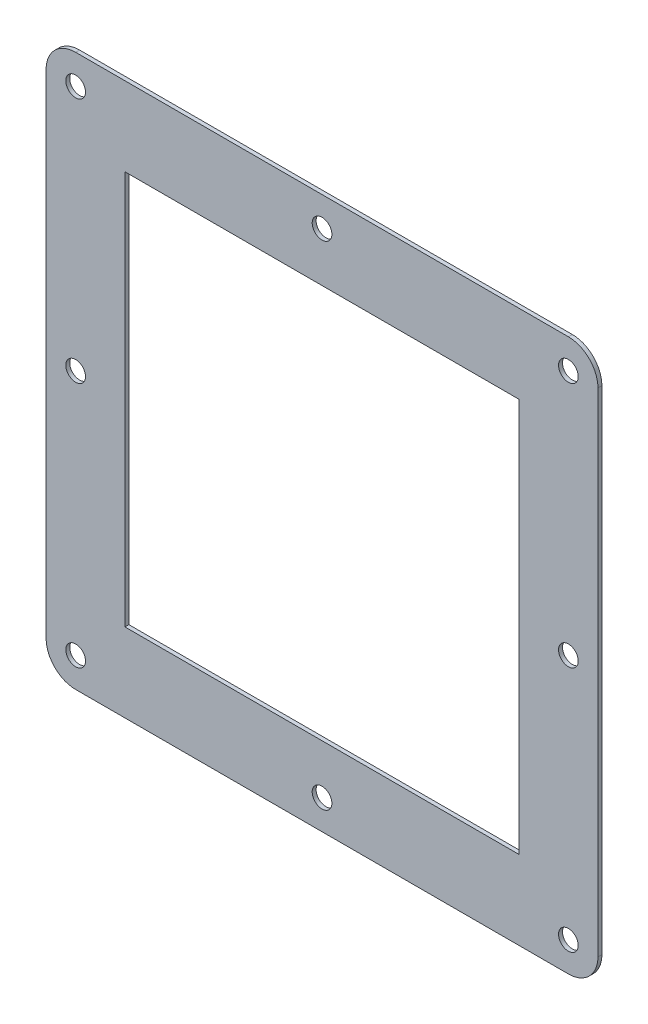
ISO-10303-21;
HEADER;
FILE_DESCRIPTION(('STEP AP214'),'2;1');
FILE_NAME('part.step','',(''),(''),'','','');
FILE_SCHEMA(('AUTOMOTIVE_DESIGN { 1 0 10303 214 1 1 1 1 }'));
ENDSEC;
DATA;
#1=APPLICATION_CONTEXT('core data for automotive mechanical design processes');
#2=APPLICATION_PROTOCOL_DEFINITION('international standard','automotive_design',2000,#1);
#3=PRODUCT_CONTEXT('',#1,'mechanical');
#4=PRODUCT('Part','Part','',(#3));
#5=PRODUCT_RELATED_PRODUCT_CATEGORY('part','',(#4));
#6=PRODUCT_DEFINITION_FORMATION('','',#4);
#7=PRODUCT_DEFINITION_CONTEXT('part definition',#1,'design');
#8=PRODUCT_DEFINITION('design','',#6,#7);
#9=PRODUCT_DEFINITION_SHAPE('','',#8);
#10=(LENGTH_UNIT() NAMED_UNIT(*) SI_UNIT(.MILLI.,.METRE.));
#11=(NAMED_UNIT(*) PLANE_ANGLE_UNIT() SI_UNIT($,.RADIAN.));
#12=(NAMED_UNIT(*) SI_UNIT($,.STERADIAN.) SOLID_ANGLE_UNIT());
#13=UNCERTAINTY_MEASURE_WITH_UNIT(LENGTH_MEASURE(1.E-05),#10,'distance_accuracy_value','');
#14=(GEOMETRIC_REPRESENTATION_CONTEXT(3) GLOBAL_UNCERTAINTY_ASSIGNED_CONTEXT((#13)) GLOBAL_UNIT_ASSIGNED_CONTEXT((#10,
#11,#12)) REPRESENTATION_CONTEXT('',''));
#15=CARTESIAN_POINT('',(0.,0.,0.));
#16=DIRECTION('',(0.,0.,1.));
#17=DIRECTION('',(1.,0.,0.));
#18=AXIS2_PLACEMENT_3D('',#15,#16,#17);
#19=CARTESIAN_POINT('',(-125.,-125.,2.));
#20=DIRECTION('',(0.,0.,1.));
#21=DIRECTION('',(1.,0.,0.));
#22=AXIS2_PLACEMENT_3D('',#19,#20,#21);
#23=PLANE('',#22);
#24=DIRECTION('',(0.,1.,0.));
#25=VECTOR('',#24,1.);
#26=CARTESIAN_POINT('',(100.,100.,2.));
#27=LINE('',#26,#25);
#28=CARTESIAN_POINT('',(100.,-100.,2.));
#29=VERTEX_POINT('',#28);
#30=CARTESIAN_POINT('',(100.,100.,2.));
#31=VERTEX_POINT('',#30);
#32=EDGE_CURVE('E48',#29,#31,#27,.T.);
#33=ORIENTED_EDGE('',*,*,#32,.F.);
#34=DIRECTION('',(1.,0.,0.));
#35=VECTOR('',#34,1.);
#36=CARTESIAN_POINT('',(-100.,-100.,2.));
#37=LINE('',#36,#35);
#38=CARTESIAN_POINT('',(-100.,-100.,2.));
#39=VERTEX_POINT('',#38);
#40=EDGE_CURVE('E140',#39,#29,#37,.T.);
#41=ORIENTED_EDGE('',*,*,#40,.F.);
#42=DIRECTION('',(0.,-1.,0.));
#43=VECTOR('',#42,1.);
#44=CARTESIAN_POINT('',(-100.,100.,2.));
#45=LINE('',#44,#43);
#46=CARTESIAN_POINT('',(-100.,100.,2.));
#47=VERTEX_POINT('',#46);
#48=EDGE_CURVE('E125',#47,#39,#45,.T.);
#49=ORIENTED_EDGE('',*,*,#48,.F.);
#50=DIRECTION('',(-1.,0.,0.));
#51=VECTOR('',#50,1.);
#52=CARTESIAN_POINT('',(-100.,100.,2.));
#53=LINE('',#52,#51);
#54=EDGE_CURVE('E134',#31,#47,#53,.T.);
#55=ORIENTED_EDGE('',*,*,#54,.F.);
#56=EDGE_LOOP('',(#33,#41,#49,#55));
#57=FACE_BOUND('',#56,.T.);
#58=CARTESIAN_POINT('',(0.,-125.,2.));
#59=DIRECTION('',(0.,0.,1.));
#60=DIRECTION('',(1.,0.,0.));
#61=AXIS2_PLACEMENT_3D('',#58,#59,#60);
#62=CIRCLE('',#61,5.);
#63=CARTESIAN_POINT('',(5.,-125.,2.));
#64=VERTEX_POINT('',#63);
#65=EDGE_CURVE('E156',#64,#64,#62,.T.);
#66=ORIENTED_EDGE('',*,*,#65,.F.);
#67=EDGE_LOOP('',(#66));
#68=FACE_BOUND('',#67,.T.);
#69=CARTESIAN_POINT('',(125.,0.,2.));
#70=DIRECTION('',(0.,0.,1.));
#71=DIRECTION('',(1.,0.,0.));
#72=AXIS2_PLACEMENT_3D('',#69,#70,#71);
#73=CIRCLE('',#72,5.00000000000001);
#74=CARTESIAN_POINT('',(130.,0.,2.));
#75=VERTEX_POINT('',#74);
#76=EDGE_CURVE('E174',#75,#75,#73,.T.);
#77=ORIENTED_EDGE('',*,*,#76,.F.);
#78=EDGE_LOOP('',(#77));
#79=FACE_BOUND('',#78,.T.);
#80=CARTESIAN_POINT('',(0.,125.,2.));
#81=DIRECTION('',(0.,0.,1.));
#82=DIRECTION('',(1.,0.,0.));
#83=AXIS2_PLACEMENT_3D('',#80,#81,#82);
#84=CIRCLE('',#83,5.);
#85=CARTESIAN_POINT('',(4.99999999999999,125.,2.));
#86=VERTEX_POINT('',#85);
#87=EDGE_CURVE('E186',#86,#86,#84,.T.);
#88=ORIENTED_EDGE('',*,*,#87,.F.);
#89=EDGE_LOOP('',(#88));
#90=FACE_BOUND('',#89,.T.);
#91=CARTESIAN_POINT('',(-125.,-125.,2.));
#92=DIRECTION('',(0.,0.,1.));
#93=DIRECTION('',(1.,0.,0.));
#94=AXIS2_PLACEMENT_3D('',#91,#92,#93);
#95=CIRCLE('',#94,15.);
#96=CARTESIAN_POINT('',(-140.,-125.,2.));
#97=VERTEX_POINT('',#96);
#98=CARTESIAN_POINT('',(-125.,-140.,2.));
#99=VERTEX_POINT('',#98);
#100=EDGE_CURVE('E198',#97,#99,#95,.T.);
#101=ORIENTED_EDGE('',*,*,#100,.T.);
#102=DIRECTION('',(1.,0.,0.));
#103=VECTOR('',#102,1.);
#104=CARTESIAN_POINT('',(-125.,-140.,2.));
#105=LINE('',#104,#103);
#106=CARTESIAN_POINT('',(125.,-140.,2.));
#107=VERTEX_POINT('',#106);
#108=EDGE_CURVE('E201',#99,#107,#105,.T.);
#109=ORIENTED_EDGE('',*,*,#108,.T.);
#110=CARTESIAN_POINT('',(125.,-125.,2.));
#111=DIRECTION('',(0.,0.,1.));
#112=DIRECTION('',(1.,0.,0.));
#113=AXIS2_PLACEMENT_3D('',#110,#111,#112);
#114=CIRCLE('',#113,15.);
#115=CARTESIAN_POINT('',(140.,-125.,2.));
#116=VERTEX_POINT('',#115);
#117=EDGE_CURVE('E204',#107,#116,#114,.T.);
#118=ORIENTED_EDGE('',*,*,#117,.T.);
#119=DIRECTION('',(0.,1.,0.));
#120=VECTOR('',#119,1.);
#121=CARTESIAN_POINT('',(140.,125.,2.));
#122=LINE('',#121,#120);
#123=CARTESIAN_POINT('',(140.,125.,2.));
#124=VERTEX_POINT('',#123);
#125=EDGE_CURVE('E206',#116,#124,#122,.T.);
#126=ORIENTED_EDGE('',*,*,#125,.T.);
#127=CARTESIAN_POINT('',(125.,125.,2.));
#128=DIRECTION('',(0.,0.,1.));
#129=DIRECTION('',(-1.,0.,0.));
#130=AXIS2_PLACEMENT_3D('',#127,#128,#129);
#131=CIRCLE('',#130,15.);
#132=CARTESIAN_POINT('',(125.,140.,2.));
#133=VERTEX_POINT('',#132);
#134=EDGE_CURVE('E208',#124,#133,#131,.T.);
#135=ORIENTED_EDGE('',*,*,#134,.T.);
#136=DIRECTION('',(-1.,0.,0.));
#137=VECTOR('',#136,1.);
#138=CARTESIAN_POINT('',(-125.,140.,2.));
#139=LINE('',#138,#137);
#140=CARTESIAN_POINT('',(-125.,140.,2.));
#141=VERTEX_POINT('',#140);
#142=EDGE_CURVE('E210',#133,#141,#139,.T.);
#143=ORIENTED_EDGE('',*,*,#142,.T.);
#144=CARTESIAN_POINT('',(-125.,125.,2.));
#145=DIRECTION('',(0.,0.,1.));
#146=DIRECTION('',(1.,0.,0.));
#147=AXIS2_PLACEMENT_3D('',#144,#145,#146);
#148=CIRCLE('',#147,15.);
#149=CARTESIAN_POINT('',(-140.,125.,2.));
#150=VERTEX_POINT('',#149);
#151=EDGE_CURVE('E212',#141,#150,#148,.T.);
#152=ORIENTED_EDGE('',*,*,#151,.T.);
#153=DIRECTION('',(0.,-1.,0.));
#154=VECTOR('',#153,1.);
#155=CARTESIAN_POINT('',(-140.,125.,2.));
#156=LINE('',#155,#154);
#157=EDGE_CURVE('E214',#150,#97,#156,.T.);
#158=ORIENTED_EDGE('',*,*,#157,.T.);
#159=EDGE_LOOP('',(#101,#109,#118,#126,#135,#143,#152,#158));
#160=FACE_BOUND('',#159,.T.);
#161=CARTESIAN_POINT('',(-125.,125.,2.));
#162=DIRECTION('',(0.,0.,1.));
#163=DIRECTION('',(1.,0.,0.));
#164=AXIS2_PLACEMENT_3D('',#161,#162,#163);
#165=CIRCLE('',#164,5.00000000000001);
#166=CARTESIAN_POINT('',(-120.,125.,2.));
#167=VERTEX_POINT('',#166);
#168=EDGE_CURVE('E192',#167,#167,#165,.T.);
#169=ORIENTED_EDGE('',*,*,#168,.F.);
#170=EDGE_LOOP('',(#169));
#171=FACE_BOUND('',#170,.T.);
#172=CARTESIAN_POINT('',(125.,125.,2.));
#173=DIRECTION('',(0.,0.,1.));
#174=DIRECTION('',(1.,0.,0.));
#175=AXIS2_PLACEMENT_3D('',#172,#173,#174);
#176=CIRCLE('',#175,4.99999999999999);
#177=CARTESIAN_POINT('',(130.,125.,2.));
#178=VERTEX_POINT('',#177);
#179=EDGE_CURVE('E180',#178,#178,#176,.T.);
#180=ORIENTED_EDGE('',*,*,#179,.F.);
#181=EDGE_LOOP('',(#180));
#182=FACE_BOUND('',#181,.T.);
#183=CARTESIAN_POINT('',(-125.,0.,2.));
#184=DIRECTION('',(0.,0.,1.));
#185=DIRECTION('',(1.,0.,0.));
#186=AXIS2_PLACEMENT_3D('',#183,#184,#185);
#187=CIRCLE('',#186,5.);
#188=CARTESIAN_POINT('',(-120.,0.,2.));
#189=VERTEX_POINT('',#188);
#190=EDGE_CURVE('E168',#189,#189,#187,.T.);
#191=ORIENTED_EDGE('',*,*,#190,.F.);
#192=EDGE_LOOP('',(#191));
#193=FACE_BOUND('',#192,.T.);
#194=CARTESIAN_POINT('',(-125.,-125.,2.));
#195=DIRECTION('',(0.,0.,1.));
#196=DIRECTION('',(1.,0.,0.));
#197=AXIS2_PLACEMENT_3D('',#194,#195,#196);
#198=CIRCLE('',#197,5.00000000000001);
#199=CARTESIAN_POINT('',(-120.,-125.,2.));
#200=VERTEX_POINT('',#199);
#201=EDGE_CURVE('E162',#200,#200,#198,.T.);
#202=ORIENTED_EDGE('',*,*,#201,.F.);
#203=EDGE_LOOP('',(#202));
#204=FACE_BOUND('',#203,.T.);
#205=CARTESIAN_POINT('',(125.,-125.,2.));
#206=DIRECTION('',(0.,0.,1.));
#207=DIRECTION('',(1.,0.,0.));
#208=AXIS2_PLACEMENT_3D('',#205,#206,#207);
#209=CIRCLE('',#208,5.00000000000002);
#210=CARTESIAN_POINT('',(130.,-125.,2.));
#211=VERTEX_POINT('',#210);
#212=EDGE_CURVE('E150',#211,#211,#209,.T.);
#213=ORIENTED_EDGE('',*,*,#212,.F.);
#214=EDGE_LOOP('',(#213));
#215=FACE_BOUND('',#214,.T.);
#216=ADVANCED_FACE('F33',(#57,#68,#79,#90,#160,#171,#182,#193,#204,#215),#23,.T.);
#217=CARTESIAN_POINT('',(-125.,-125.,0.));
#218=DIRECTION('',(0.,0.,1.));
#219=DIRECTION('',(1.,0.,0.));
#220=AXIS2_PLACEMENT_3D('',#217,#218,#219);
#221=PLANE('',#220);
#222=DIRECTION('',(1.,0.,0.));
#223=VECTOR('',#222,1.);
#224=CARTESIAN_POINT('',(-125.,-100.,0.));
#225=LINE('',#224,#223);
#226=CARTESIAN_POINT('',(-100.,-100.,0.));
#227=VERTEX_POINT('',#226);
#228=CARTESIAN_POINT('',(100.,-100.,0.));
#229=VERTEX_POINT('',#228);
#230=EDGE_CURVE('E41',#227,#229,#225,.T.);
#231=ORIENTED_EDGE('',*,*,#230,.T.);
#232=DIRECTION('',(0.,1.,0.));
#233=VECTOR('',#232,1.);
#234=CARTESIAN_POINT('',(100.,-125.,0.));
#235=LINE('',#234,#233);
#236=CARTESIAN_POINT('',(100.,100.,0.));
#237=VERTEX_POINT('',#236);
#238=EDGE_CURVE('E11',#229,#237,#235,.T.);
#239=ORIENTED_EDGE('',*,*,#238,.T.);
#240=DIRECTION('',(-1.,0.,0.));
#241=VECTOR('',#240,1.);
#242=CARTESIAN_POINT('',(-125.,100.,0.));
#243=LINE('',#242,#241);
#244=CARTESIAN_POINT('',(-100.,100.,0.));
#245=VERTEX_POINT('',#244);
#246=EDGE_CURVE('E255',#237,#245,#243,.T.);
#247=ORIENTED_EDGE('',*,*,#246,.T.);
#248=DIRECTION('',(0.,-1.,0.));
#249=VECTOR('',#248,1.);
#250=CARTESIAN_POINT('',(-100.,-125.,0.));
#251=LINE('',#250,#249);
#252=EDGE_CURVE('E128',#245,#227,#251,.T.);
#253=ORIENTED_EDGE('',*,*,#252,.T.);
#254=EDGE_LOOP('',(#231,#239,#247,#253));
#255=FACE_BOUND('',#254,.T.);
#256=CARTESIAN_POINT('',(-125.,-125.,0.));
#257=DIRECTION('',(0.,0.,1.));
#258=DIRECTION('',(1.,0.,0.));
#259=AXIS2_PLACEMENT_3D('',#256,#257,#258);
#260=CIRCLE('',#259,15.);
#261=CARTESIAN_POINT('',(-140.,-125.,0.));
#262=VERTEX_POINT('',#261);
#263=CARTESIAN_POINT('',(-125.,-140.,0.));
#264=VERTEX_POINT('',#263);
#265=EDGE_CURVE('E195',#262,#264,#260,.T.);
#266=ORIENTED_EDGE('',*,*,#265,.F.);
#267=DIRECTION('',(0.,-1.,0.));
#268=VECTOR('',#267,1.);
#269=CARTESIAN_POINT('',(-140.,125.,0.));
#270=LINE('',#269,#268);
#271=CARTESIAN_POINT('',(-140.,125.,0.));
#272=VERTEX_POINT('',#271);
#273=EDGE_CURVE('E202',#272,#262,#270,.T.);
#274=ORIENTED_EDGE('',*,*,#273,.F.);
#275=CARTESIAN_POINT('',(-125.,125.,0.));
#276=DIRECTION('',(0.,0.,1.));
#277=DIRECTION('',(1.,0.,0.));
#278=AXIS2_PLACEMENT_3D('',#275,#276,#277);
#279=CIRCLE('',#278,15.);
#280=CARTESIAN_POINT('',(-125.,140.,0.));
#281=VERTEX_POINT('',#280);
#282=EDGE_CURVE('E229',#281,#272,#279,.T.);
#283=ORIENTED_EDGE('',*,*,#282,.F.);
#284=DIRECTION('',(-1.,0.,0.));
#285=VECTOR('',#284,1.);
#286=CARTESIAN_POINT('',(-125.,140.,0.));
#287=LINE('',#286,#285);
#288=CARTESIAN_POINT('',(125.,140.,0.));
#289=VERTEX_POINT('',#288);
#290=EDGE_CURVE('E227',#289,#281,#287,.T.);
#291=ORIENTED_EDGE('',*,*,#290,.F.);
#292=CARTESIAN_POINT('',(125.,125.,0.));
#293=DIRECTION('',(0.,0.,1.));
#294=DIRECTION('',(-1.,0.,0.));
#295=AXIS2_PLACEMENT_3D('',#292,#293,#294);
#296=CIRCLE('',#295,15.);
#297=CARTESIAN_POINT('',(140.,125.,0.));
#298=VERTEX_POINT('',#297);
#299=EDGE_CURVE('E225',#298,#289,#296,.T.);
#300=ORIENTED_EDGE('',*,*,#299,.F.);
#301=DIRECTION('',(0.,1.,0.));
#302=VECTOR('',#301,1.);
#303=CARTESIAN_POINT('',(140.,125.,0.));
#304=LINE('',#303,#302);
#305=CARTESIAN_POINT('',(140.,-125.,0.));
#306=VERTEX_POINT('',#305);
#307=EDGE_CURVE('E223',#306,#298,#304,.T.);
#308=ORIENTED_EDGE('',*,*,#307,.F.);
#309=CARTESIAN_POINT('',(125.,-125.,0.));
#310=DIRECTION('',(0.,0.,1.));
#311=DIRECTION('',(1.,0.,0.));
#312=AXIS2_PLACEMENT_3D('',#309,#310,#311);
#313=CIRCLE('',#312,15.);
#314=CARTESIAN_POINT('',(125.,-140.,0.));
#315=VERTEX_POINT('',#314);
#316=EDGE_CURVE('E221',#315,#306,#313,.T.);
#317=ORIENTED_EDGE('',*,*,#316,.F.);
#318=DIRECTION('',(1.,0.,0.));
#319=VECTOR('',#318,1.);
#320=CARTESIAN_POINT('',(-125.,-140.,0.));
#321=LINE('',#320,#319);
#322=EDGE_CURVE('E219',#264,#315,#321,.T.);
#323=ORIENTED_EDGE('',*,*,#322,.F.);
#324=EDGE_LOOP('',(#266,#274,#283,#291,#300,#308,#317,#323));
#325=FACE_BOUND('',#324,.T.);
#326=CARTESIAN_POINT('',(-125.,125.,0.));
#327=DIRECTION('',(0.,0.,1.));
#328=DIRECTION('',(1.,0.,0.));
#329=AXIS2_PLACEMENT_3D('',#326,#327,#328);
#330=CIRCLE('',#329,5.00000000000001);
#331=CARTESIAN_POINT('',(-120.,125.,0.));
#332=VERTEX_POINT('',#331);
#333=EDGE_CURVE('E189',#332,#332,#330,.T.);
#334=ORIENTED_EDGE('',*,*,#333,.T.);
#335=EDGE_LOOP('',(#334));
#336=FACE_BOUND('',#335,.T.);
#337=CARTESIAN_POINT('',(0.,125.,0.));
#338=DIRECTION('',(0.,0.,1.));
#339=DIRECTION('',(1.,0.,0.));
#340=AXIS2_PLACEMENT_3D('',#337,#338,#339);
#341=CIRCLE('',#340,5.);
#342=CARTESIAN_POINT('',(4.99999999999999,125.,0.));
#343=VERTEX_POINT('',#342);
#344=EDGE_CURVE('E183',#343,#343,#341,.T.);
#345=ORIENTED_EDGE('',*,*,#344,.T.);
#346=EDGE_LOOP('',(#345));
#347=FACE_BOUND('',#346,.T.);
#348=CARTESIAN_POINT('',(125.,125.,0.));
#349=DIRECTION('',(0.,0.,1.));
#350=DIRECTION('',(1.,0.,0.));
#351=AXIS2_PLACEMENT_3D('',#348,#349,#350);
#352=CIRCLE('',#351,4.99999999999999);
#353=CARTESIAN_POINT('',(130.,125.,0.));
#354=VERTEX_POINT('',#353);
#355=EDGE_CURVE('E177',#354,#354,#352,.T.);
#356=ORIENTED_EDGE('',*,*,#355,.T.);
#357=EDGE_LOOP('',(#356));
#358=FACE_BOUND('',#357,.T.);
#359=CARTESIAN_POINT('',(125.,0.,0.));
#360=DIRECTION('',(0.,0.,1.));
#361=DIRECTION('',(1.,0.,0.));
#362=AXIS2_PLACEMENT_3D('',#359,#360,#361);
#363=CIRCLE('',#362,5.00000000000001);
#364=CARTESIAN_POINT('',(130.,0.,0.));
#365=VERTEX_POINT('',#364);
#366=EDGE_CURVE('E171',#365,#365,#363,.T.);
#367=ORIENTED_EDGE('',*,*,#366,.T.);
#368=EDGE_LOOP('',(#367));
#369=FACE_BOUND('',#368,.T.);
#370=CARTESIAN_POINT('',(-125.,0.,0.));
#371=DIRECTION('',(0.,0.,1.));
#372=DIRECTION('',(1.,0.,0.));
#373=AXIS2_PLACEMENT_3D('',#370,#371,#372);
#374=CIRCLE('',#373,5.);
#375=CARTESIAN_POINT('',(-120.,0.,0.));
#376=VERTEX_POINT('',#375);
#377=EDGE_CURVE('E165',#376,#376,#374,.T.);
#378=ORIENTED_EDGE('',*,*,#377,.T.);
#379=EDGE_LOOP('',(#378));
#380=FACE_BOUND('',#379,.T.);
#381=CARTESIAN_POINT('',(-125.,-125.,0.));
#382=DIRECTION('',(0.,0.,1.));
#383=DIRECTION('',(1.,0.,0.));
#384=AXIS2_PLACEMENT_3D('',#381,#382,#383);
#385=CIRCLE('',#384,5.00000000000001);
#386=CARTESIAN_POINT('',(-120.,-125.,0.));
#387=VERTEX_POINT('',#386);
#388=EDGE_CURVE('E159',#387,#387,#385,.T.);
#389=ORIENTED_EDGE('',*,*,#388,.T.);
#390=EDGE_LOOP('',(#389));
#391=FACE_BOUND('',#390,.T.);
#392=CARTESIAN_POINT('',(0.,-125.,0.));
#393=DIRECTION('',(0.,0.,1.));
#394=DIRECTION('',(1.,0.,0.));
#395=AXIS2_PLACEMENT_3D('',#392,#393,#394);
#396=CIRCLE('',#395,5.);
#397=CARTESIAN_POINT('',(5.,-125.,0.));
#398=VERTEX_POINT('',#397);
#399=EDGE_CURVE('E153',#398,#398,#396,.T.);
#400=ORIENTED_EDGE('',*,*,#399,.T.);
#401=EDGE_LOOP('',(#400));
#402=FACE_BOUND('',#401,.T.);
#403=CARTESIAN_POINT('',(125.,-125.,0.));
#404=DIRECTION('',(0.,0.,1.));
#405=DIRECTION('',(1.,0.,0.));
#406=AXIS2_PLACEMENT_3D('',#403,#404,#405);
#407=CIRCLE('',#406,5.00000000000002);
#408=CARTESIAN_POINT('',(130.,-125.,0.));
#409=VERTEX_POINT('',#408);
#410=EDGE_CURVE('E147',#409,#409,#407,.T.);
#411=ORIENTED_EDGE('',*,*,#410,.T.);
#412=EDGE_LOOP('',(#411));
#413=FACE_BOUND('',#412,.T.);
#414=ADVANCED_FACE('F259',(#255,#325,#336,#347,#358,#369,#380,#391,#402,#413),#221,.F.);
#415=CARTESIAN_POINT('',(-125.,-125.,2.));
#416=DIRECTION('',(0.,0.,-1.));
#417=DIRECTION('',(-1.,0.,0.));
#418=AXIS2_PLACEMENT_3D('',#415,#416,#417);
#419=CYLINDRICAL_SURFACE('',#418,15.);
#420=ORIENTED_EDGE('',*,*,#265,.T.);
#421=DIRECTION('',(0.,0.,-1.));
#422=VECTOR('',#421,1.);
#423=CARTESIAN_POINT('',(-125.,-140.,2.));
#424=LINE('',#423,#422);
#425=EDGE_CURVE('E252',#99,#264,#424,.T.);
#426=ORIENTED_EDGE('',*,*,#425,.F.);
#427=ORIENTED_EDGE('',*,*,#100,.F.);
#428=DIRECTION('',(0.,0.,-1.));
#429=VECTOR('',#428,1.);
#430=CARTESIAN_POINT('',(-140.,-125.,2.));
#431=LINE('',#430,#429);
#432=EDGE_CURVE('E216',#97,#262,#431,.T.);
#433=ORIENTED_EDGE('',*,*,#432,.T.);
#434=EDGE_LOOP('',(#420,#426,#427,#433));
#435=FACE_BOUND('',#434,.T.);
#436=ADVANCED_FACE('F35',(#435),#419,.T.);
#437=CARTESIAN_POINT('',(-125.,-140.,2.));
#438=DIRECTION('',(0.,1.,0.));
#439=DIRECTION('',(0.,0.,1.));
#440=AXIS2_PLACEMENT_3D('',#437,#438,#439);
#441=PLANE('',#440);
#442=ORIENTED_EDGE('',*,*,#322,.T.);
#443=DIRECTION('',(0.,0.,-1.));
#444=VECTOR('',#443,1.);
#445=CARTESIAN_POINT('',(125.,-140.,2.));
#446=LINE('',#445,#444);
#447=EDGE_CURVE('E249',#107,#315,#446,.T.);
#448=ORIENTED_EDGE('',*,*,#447,.F.);
#449=ORIENTED_EDGE('',*,*,#108,.F.);
#450=ORIENTED_EDGE('',*,*,#425,.T.);
#451=EDGE_LOOP('',(#442,#448,#449,#450));
#452=FACE_BOUND('',#451,.T.);
#453=ADVANCED_FACE('F309',(#452),#441,.F.);
#454=CARTESIAN_POINT('',(125.,-125.,2.));
#455=DIRECTION('',(0.,0.,-1.));
#456=DIRECTION('',(-1.,0.,0.));
#457=AXIS2_PLACEMENT_3D('',#454,#455,#456);
#458=CYLINDRICAL_SURFACE('',#457,15.);
#459=ORIENTED_EDGE('',*,*,#316,.T.);
#460=DIRECTION('',(0.,0.,-1.));
#461=VECTOR('',#460,1.);
#462=CARTESIAN_POINT('',(140.,-125.,2.));
#463=LINE('',#462,#461);
#464=EDGE_CURVE('E246',#116,#306,#463,.T.);
#465=ORIENTED_EDGE('',*,*,#464,.F.);
#466=ORIENTED_EDGE('',*,*,#117,.F.);
#467=ORIENTED_EDGE('',*,*,#447,.T.);
#468=EDGE_LOOP('',(#459,#465,#466,#467));
#469=FACE_BOUND('',#468,.T.);
#470=ADVANCED_FACE('F306',(#469),#458,.T.);
#471=CARTESIAN_POINT('',(140.,125.,2.));
#472=DIRECTION('',(-1.,0.,0.));
#473=DIRECTION('',(0.,0.,1.));
#474=AXIS2_PLACEMENT_3D('',#471,#472,#473);
#475=PLANE('',#474);
#476=ORIENTED_EDGE('',*,*,#307,.T.);
#477=DIRECTION('',(0.,0.,-1.));
#478=VECTOR('',#477,1.);
#479=CARTESIAN_POINT('',(140.,125.,2.));
#480=LINE('',#479,#478);
#481=EDGE_CURVE('E243',#124,#298,#480,.T.);
#482=ORIENTED_EDGE('',*,*,#481,.F.);
#483=ORIENTED_EDGE('',*,*,#125,.F.);
#484=ORIENTED_EDGE('',*,*,#464,.T.);
#485=EDGE_LOOP('',(#476,#482,#483,#484));
#486=FACE_BOUND('',#485,.T.);
#487=ADVANCED_FACE('F302',(#486),#475,.F.);
#488=CARTESIAN_POINT('',(125.,125.,2.));
#489=DIRECTION('',(0.,0.,-1.));
#490=DIRECTION('',(-1.,0.,0.));
#491=AXIS2_PLACEMENT_3D('',#488,#489,#490);
#492=CYLINDRICAL_SURFACE('',#491,15.);
#493=ORIENTED_EDGE('',*,*,#299,.T.);
#494=DIRECTION('',(0.,0.,-1.));
#495=VECTOR('',#494,1.);
#496=CARTESIAN_POINT('',(125.,140.,2.));
#497=LINE('',#496,#495);
#498=EDGE_CURVE('E240',#133,#289,#497,.T.);
#499=ORIENTED_EDGE('',*,*,#498,.F.);
#500=ORIENTED_EDGE('',*,*,#134,.F.);
#501=ORIENTED_EDGE('',*,*,#481,.T.);
#502=EDGE_LOOP('',(#493,#499,#500,#501));
#503=FACE_BOUND('',#502,.T.);
#504=ADVANCED_FACE('F298',(#503),#492,.T.);
#505=CARTESIAN_POINT('',(-125.,140.,2.));
#506=DIRECTION('',(0.,-1.,0.));
#507=DIRECTION('',(0.,0.,-1.));
#508=AXIS2_PLACEMENT_3D('',#505,#506,#507);
#509=PLANE('',#508);
#510=ORIENTED_EDGE('',*,*,#290,.T.);
#511=DIRECTION('',(0.,0.,-1.));
#512=VECTOR('',#511,1.);
#513=CARTESIAN_POINT('',(-125.,140.,2.));
#514=LINE('',#513,#512);
#515=EDGE_CURVE('E237',#141,#281,#514,.T.);
#516=ORIENTED_EDGE('',*,*,#515,.F.);
#517=ORIENTED_EDGE('',*,*,#142,.F.);
#518=ORIENTED_EDGE('',*,*,#498,.T.);
#519=EDGE_LOOP('',(#510,#516,#517,#518));
#520=FACE_BOUND('',#519,.T.);
#521=ADVANCED_FACE('F294',(#520),#509,.F.);
#522=CARTESIAN_POINT('',(-125.,125.,2.));
#523=DIRECTION('',(0.,0.,-1.));
#524=DIRECTION('',(-1.,0.,0.));
#525=AXIS2_PLACEMENT_3D('',#522,#523,#524);
#526=CYLINDRICAL_SURFACE('',#525,15.);
#527=ORIENTED_EDGE('',*,*,#282,.T.);
#528=DIRECTION('',(0.,0.,-1.));
#529=VECTOR('',#528,1.);
#530=CARTESIAN_POINT('',(-140.,125.,2.));
#531=LINE('',#530,#529);
#532=EDGE_CURVE('E234',#150,#272,#531,.T.);
#533=ORIENTED_EDGE('',*,*,#532,.F.);
#534=ORIENTED_EDGE('',*,*,#151,.F.);
#535=ORIENTED_EDGE('',*,*,#515,.T.);
#536=EDGE_LOOP('',(#527,#533,#534,#535));
#537=FACE_BOUND('',#536,.T.);
#538=ADVANCED_FACE('F290',(#537),#526,.T.);
#539=CARTESIAN_POINT('',(-140.,125.,2.));
#540=DIRECTION('',(1.,0.,0.));
#541=DIRECTION('',(0.,0.,-1.));
#542=AXIS2_PLACEMENT_3D('',#539,#540,#541);
#543=PLANE('',#542);
#544=ORIENTED_EDGE('',*,*,#273,.T.);
#545=ORIENTED_EDGE('',*,*,#432,.F.);
#546=ORIENTED_EDGE('',*,*,#157,.F.);
#547=ORIENTED_EDGE('',*,*,#532,.T.);
#548=EDGE_LOOP('',(#544,#545,#546,#547));
#549=FACE_BOUND('',#548,.T.);
#550=ADVANCED_FACE('F287',(#549),#543,.F.);
#551=CARTESIAN_POINT('',(-125.,125.,2.));
#552=DIRECTION('',(0.,0.,-1.));
#553=DIRECTION('',(-1.,0.,0.));
#554=AXIS2_PLACEMENT_3D('',#551,#552,#553);
#555=CYLINDRICAL_SURFACE('',#554,5.00000000000001);
#556=ORIENTED_EDGE('',*,*,#168,.T.);
#557=EDGE_LOOP('',(#556));
#558=FACE_BOUND('',#557,.T.);
#559=ORIENTED_EDGE('',*,*,#333,.F.);
#560=EDGE_LOOP('',(#559));
#561=FACE_BOUND('',#560,.T.);
#562=ADVANCED_FACE('F284',(#558,#561),#555,.F.);
#563=CARTESIAN_POINT('',(0.,125.,2.));
#564=DIRECTION('',(0.,0.,-1.));
#565=DIRECTION('',(-1.,0.,0.));
#566=AXIS2_PLACEMENT_3D('',#563,#564,#565);
#567=CYLINDRICAL_SURFACE('',#566,5.);
#568=ORIENTED_EDGE('',*,*,#87,.T.);
#569=EDGE_LOOP('',(#568));
#570=FACE_BOUND('',#569,.T.);
#571=ORIENTED_EDGE('',*,*,#344,.F.);
#572=EDGE_LOOP('',(#571));
#573=FACE_BOUND('',#572,.T.);
#574=ADVANCED_FACE('F380',(#570,#573),#567,.F.);
#575=CARTESIAN_POINT('',(125.,125.,2.));
#576=DIRECTION('',(0.,0.,-1.));
#577=DIRECTION('',(-1.,0.,0.));
#578=AXIS2_PLACEMENT_3D('',#575,#576,#577);
#579=CYLINDRICAL_SURFACE('',#578,4.99999999999999);
#580=ORIENTED_EDGE('',*,*,#179,.T.);
#581=EDGE_LOOP('',(#580));
#582=FACE_BOUND('',#581,.T.);
#583=ORIENTED_EDGE('',*,*,#355,.F.);
#584=EDGE_LOOP('',(#583));
#585=FACE_BOUND('',#584,.T.);
#586=ADVANCED_FACE('F377',(#582,#585),#579,.F.);
#587=CARTESIAN_POINT('',(125.,0.,2.));
#588=DIRECTION('',(0.,0.,-1.));
#589=DIRECTION('',(-1.,0.,0.));
#590=AXIS2_PLACEMENT_3D('',#587,#588,#589);
#591=CYLINDRICAL_SURFACE('',#590,5.00000000000001);
#592=ORIENTED_EDGE('',*,*,#76,.T.);
#593=EDGE_LOOP('',(#592));
#594=FACE_BOUND('',#593,.T.);
#595=ORIENTED_EDGE('',*,*,#366,.F.);
#596=EDGE_LOOP('',(#595));
#597=FACE_BOUND('',#596,.T.);
#598=ADVANCED_FACE('F373',(#594,#597),#591,.F.);
#599=CARTESIAN_POINT('',(-125.,0.,2.));
#600=DIRECTION('',(0.,0.,-1.));
#601=DIRECTION('',(-1.,0.,0.));
#602=AXIS2_PLACEMENT_3D('',#599,#600,#601);
#603=CYLINDRICAL_SURFACE('',#602,5.);
#604=ORIENTED_EDGE('',*,*,#190,.T.);
#605=EDGE_LOOP('',(#604));
#606=FACE_BOUND('',#605,.T.);
#607=ORIENTED_EDGE('',*,*,#377,.F.);
#608=EDGE_LOOP('',(#607));
#609=FACE_BOUND('',#608,.T.);
#610=ADVANCED_FACE('F358',(#606,#609),#603,.F.);
#611=CARTESIAN_POINT('',(-125.,-125.,2.));
#612=DIRECTION('',(0.,0.,-1.));
#613=DIRECTION('',(-1.,0.,0.));
#614=AXIS2_PLACEMENT_3D('',#611,#612,#613);
#615=CYLINDRICAL_SURFACE('',#614,5.00000000000001);
#616=ORIENTED_EDGE('',*,*,#201,.T.);
#617=EDGE_LOOP('',(#616));
#618=FACE_BOUND('',#617,.T.);
#619=ORIENTED_EDGE('',*,*,#388,.F.);
#620=EDGE_LOOP('',(#619));
#621=FACE_BOUND('',#620,.T.);
#622=ADVANCED_FACE('F355',(#618,#621),#615,.F.);
#623=CARTESIAN_POINT('',(0.,-125.,2.));
#624=DIRECTION('',(0.,0.,-1.));
#625=DIRECTION('',(-1.,0.,0.));
#626=AXIS2_PLACEMENT_3D('',#623,#624,#625);
#627=CYLINDRICAL_SURFACE('',#626,5.);
#628=ORIENTED_EDGE('',*,*,#65,.T.);
#629=EDGE_LOOP('',(#628));
#630=FACE_BOUND('',#629,.T.);
#631=ORIENTED_EDGE('',*,*,#399,.F.);
#632=EDGE_LOOP('',(#631));
#633=FACE_BOUND('',#632,.T.);
#634=ADVANCED_FACE('F273',(#630,#633),#627,.F.);
#635=CARTESIAN_POINT('',(125.,-125.,2.));
#636=DIRECTION('',(0.,0.,-1.));
#637=DIRECTION('',(-1.,0.,0.));
#638=AXIS2_PLACEMENT_3D('',#635,#636,#637);
#639=CYLINDRICAL_SURFACE('',#638,5.00000000000002);
#640=ORIENTED_EDGE('',*,*,#212,.T.);
#641=EDGE_LOOP('',(#640));
#642=FACE_BOUND('',#641,.T.);
#643=ORIENTED_EDGE('',*,*,#410,.F.);
#644=EDGE_LOOP('',(#643));
#645=FACE_BOUND('',#644,.T.);
#646=ADVANCED_FACE('F266',(#642,#645),#639,.F.);
#647=CARTESIAN_POINT('',(100.,100.,-8.));
#648=DIRECTION('',(1.,0.,0.));
#649=DIRECTION('',(0.,1.,0.));
#650=AXIS2_PLACEMENT_3D('',#647,#648,#649);
#651=PLANE('',#650);
#652=DIRECTION('',(0.,0.,1.));
#653=VECTOR('',#652,1.);
#654=CARTESIAN_POINT('',(100.,-100.,-8.));
#655=LINE('',#654,#653);
#656=EDGE_CURVE('E145',#229,#29,#655,.T.);
#657=ORIENTED_EDGE('',*,*,#656,.T.);
#658=ORIENTED_EDGE('',*,*,#32,.T.);
#659=DIRECTION('',(0.,0.,1.));
#660=VECTOR('',#659,1.);
#661=CARTESIAN_POINT('',(100.,100.,-8.));
#662=LINE('',#661,#660);
#663=EDGE_CURVE('E131',#237,#31,#662,.T.);
#664=ORIENTED_EDGE('',*,*,#663,.F.);
#665=ORIENTED_EDGE('',*,*,#238,.F.);
#666=EDGE_LOOP('',(#657,#658,#664,#665));
#667=FACE_BOUND('',#666,.T.);
#668=ADVANCED_FACE('F264',(#667),#651,.F.);
#669=CARTESIAN_POINT('',(-100.,-100.,-8.));
#670=DIRECTION('',(0.,-1.,0.));
#671=DIRECTION('',(0.,0.,-1.));
#672=AXIS2_PLACEMENT_3D('',#669,#670,#671);
#673=PLANE('',#672);
#674=DIRECTION('',(0.,0.,1.));
#675=VECTOR('',#674,1.);
#676=CARTESIAN_POINT('',(-100.,-100.,-8.));
#677=LINE('',#676,#675);
#678=EDGE_CURVE('E130',#227,#39,#677,.T.);
#679=ORIENTED_EDGE('',*,*,#678,.T.);
#680=ORIENTED_EDGE('',*,*,#40,.T.);
#681=ORIENTED_EDGE('',*,*,#656,.F.);
#682=ORIENTED_EDGE('',*,*,#230,.F.);
#683=EDGE_LOOP('',(#679,#680,#681,#682));
#684=FACE_BOUND('',#683,.T.);
#685=ADVANCED_FACE('F263',(#684),#673,.F.);
#686=CARTESIAN_POINT('',(-100.,100.,-8.));
#687=DIRECTION('',(-1.,0.,0.));
#688=DIRECTION('',(0.,-1.,0.));
#689=AXIS2_PLACEMENT_3D('',#686,#687,#688);
#690=PLANE('',#689);
#691=DIRECTION('',(0.,0.,1.));
#692=VECTOR('',#691,1.);
#693=CARTESIAN_POINT('',(-100.,100.,-8.));
#694=LINE('',#693,#692);
#695=EDGE_CURVE('E56',#245,#47,#694,.T.);
#696=ORIENTED_EDGE('',*,*,#695,.T.);
#697=ORIENTED_EDGE('',*,*,#48,.T.);
#698=ORIENTED_EDGE('',*,*,#678,.F.);
#699=ORIENTED_EDGE('',*,*,#252,.F.);
#700=EDGE_LOOP('',(#696,#697,#698,#699));
#701=FACE_BOUND('',#700,.T.);
#702=ADVANCED_FACE('F122',(#701),#690,.F.);
#703=CARTESIAN_POINT('',(-100.,100.,-8.));
#704=DIRECTION('',(0.,1.,0.));
#705=DIRECTION('',(0.,0.,1.));
#706=AXIS2_PLACEMENT_3D('',#703,#704,#705);
#707=PLANE('',#706);
#708=ORIENTED_EDGE('',*,*,#663,.T.);
#709=ORIENTED_EDGE('',*,*,#54,.T.);
#710=ORIENTED_EDGE('',*,*,#695,.F.);
#711=ORIENTED_EDGE('',*,*,#246,.F.);
#712=EDGE_LOOP('',(#708,#709,#710,#711));
#713=FACE_BOUND('',#712,.T.);
#714=ADVANCED_FACE('F135',(#713),#707,.F.);
#715=CLOSED_SHELL('',(#216,#414,#436,#453,#470,#487,#504,#521,#538,#550,#562,#574,#586,#598,
#610,#622,#634,#646,#668,#685,#702,#714));
#716=MANIFOLD_SOLID_BREP('B2',#715);
#717=ADVANCED_BREP_SHAPE_REPRESENTATION('',(#18,#716),#14);
#718=SHAPE_DEFINITION_REPRESENTATION(#9,#717);
ENDSEC;
END-ISO-10303-21;
